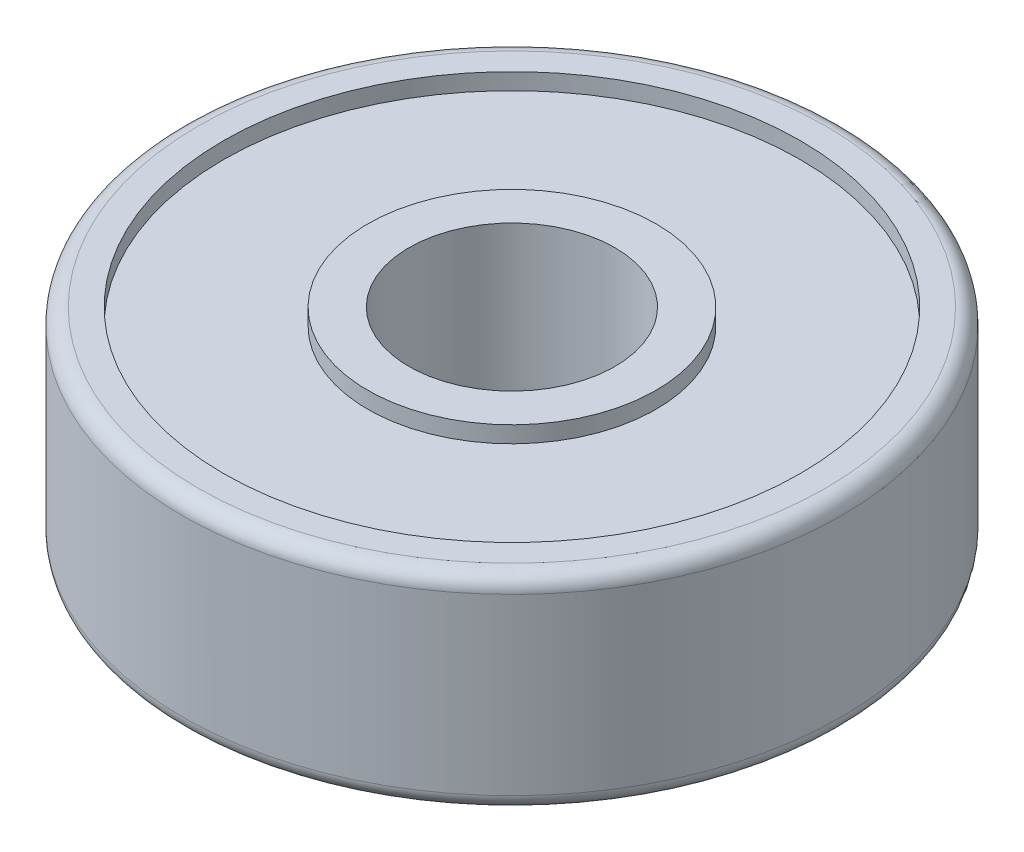
ISO-10303-21;
HEADER;
FILE_DESCRIPTION(('STEP AP214'),'2;1');
FILE_NAME('part.step','',(''),(''),'','','');
FILE_SCHEMA(('AUTOMOTIVE_DESIGN { 1 0 10303 214 1 1 1 1 }'));
ENDSEC;
DATA;
#1=APPLICATION_CONTEXT('core data for automotive mechanical design processes');
#2=APPLICATION_PROTOCOL_DEFINITION('international standard','automotive_design',2000,#1);
#3=PRODUCT_CONTEXT('',#1,'mechanical');
#4=PRODUCT('Part','Part','',(#3));
#5=PRODUCT_RELATED_PRODUCT_CATEGORY('part','',(#4));
#6=PRODUCT_DEFINITION_FORMATION('','',#4);
#7=PRODUCT_DEFINITION_CONTEXT('part definition',#1,'design');
#8=PRODUCT_DEFINITION('design','',#6,#7);
#9=PRODUCT_DEFINITION_SHAPE('','',#8);
#10=(LENGTH_UNIT() NAMED_UNIT(*) SI_UNIT(.MILLI.,.METRE.));
#11=(NAMED_UNIT(*) PLANE_ANGLE_UNIT() SI_UNIT($,.RADIAN.));
#12=(NAMED_UNIT(*) SI_UNIT($,.STERADIAN.) SOLID_ANGLE_UNIT());
#13=UNCERTAINTY_MEASURE_WITH_UNIT(LENGTH_MEASURE(1.E-05),#10,'distance_accuracy_value','');
#14=(GEOMETRIC_REPRESENTATION_CONTEXT(3) GLOBAL_UNCERTAINTY_ASSIGNED_CONTEXT((#13)) GLOBAL_UNIT_ASSIGNED_CONTEXT((#10,
#11,#12)) REPRESENTATION_CONTEXT('',''));
#15=CARTESIAN_POINT('',(0.,0.,0.));
#16=DIRECTION('',(0.,0.,1.));
#17=DIRECTION('',(1.,0.,0.));
#18=AXIS2_PLACEMENT_3D('',#15,#16,#17);
#19=CARTESIAN_POINT('',(0.,2.75,0.));
#20=DIRECTION('',(0.,-1.,0.));
#21=DIRECTION('',(0.,0.,-1.));
#22=AXIS2_PLACEMENT_3D('',#19,#20,#21);
#23=CYLINDRICAL_SURFACE('',#22,7.);
#24=CARTESIAN_POINT('',(0.,2.5,0.));
#25=DIRECTION('',(0.,-1.,0.));
#26=DIRECTION('',(0.,0.,-1.));
#27=AXIS2_PLACEMENT_3D('',#24,#25,#26);
#28=CIRCLE('',#27,7.);
#29=CARTESIAN_POINT('',(0.,2.5,-7.));
#30=VERTEX_POINT('',#29);
#31=EDGE_CURVE('E174',#30,#30,#28,.F.);
#32=ORIENTED_EDGE('',*,*,#31,.T.);
#33=EDGE_LOOP('',(#32));
#34=FACE_BOUND('',#33,.T.);
#35=CARTESIAN_POINT('',(0.,2.1,0.));
#36=DIRECTION('',(0.,-1.,0.));
#37=DIRECTION('',(0.,0.,-1.));
#38=AXIS2_PLACEMENT_3D('',#35,#36,#37);
#39=CIRCLE('',#38,7.);
#40=CARTESIAN_POINT('',(0.,2.1,-7.));
#41=VERTEX_POINT('',#40);
#42=EDGE_CURVE('E172',#41,#41,#39,.F.);
#43=ORIENTED_EDGE('',*,*,#42,.F.);
#44=EDGE_LOOP('',(#43));
#45=FACE_BOUND('',#44,.T.);
#46=ADVANCED_FACE('F17',(#34,#45),#23,.F.);
#47=CARTESIAN_POINT('',(0.,2.1,0.));
#48=DIRECTION('',(0.,1.,0.));
#49=DIRECTION('',(0.,0.,1.));
#50=AXIS2_PLACEMENT_3D('',#47,#48,#49);
#51=PLANE('',#50);
#52=ORIENTED_EDGE('',*,*,#42,.T.);
#53=EDGE_LOOP('',(#52));
#54=FACE_BOUND('',#53,.T.);
#55=CARTESIAN_POINT('',(0.,2.1,0.));
#56=DIRECTION('',(0.,-1.,0.));
#57=DIRECTION('',(0.,0.,-1.));
#58=AXIS2_PLACEMENT_3D('',#55,#56,#57);
#59=CIRCLE('',#58,3.5);
#60=CARTESIAN_POINT('',(0.,2.1,-3.5));
#61=VERTEX_POINT('',#60);
#62=EDGE_CURVE('E52',#61,#61,#59,.F.);
#63=ORIENTED_EDGE('',*,*,#62,.F.);
#64=EDGE_LOOP('',(#63));
#65=FACE_BOUND('',#64,.T.);
#66=ADVANCED_FACE('F97',(#54,#65),#51,.T.);
#67=CARTESIAN_POINT('',(0.,2.5,0.));
#68=DIRECTION('',(0.,-1.,0.));
#69=DIRECTION('',(0.,0.,-1.));
#70=AXIS2_PLACEMENT_3D('',#67,#68,#69);
#71=PLANE('',#70);
#72=ORIENTED_EDGE('',*,*,#31,.F.);
#73=EDGE_LOOP('',(#72));
#74=FACE_BOUND('',#73,.T.);
#75=CARTESIAN_POINT('',(0.,2.5,0.));
#76=DIRECTION('',(0.,-1.,0.));
#77=DIRECTION('',(1.,0.,0.));
#78=AXIS2_PLACEMENT_3D('',#75,#76,#77);
#79=CIRCLE('',#78,7.615);
#80=CARTESIAN_POINT('',(7.615,2.5,0.));
#81=VERTEX_POINT('',#80);
#82=CARTESIAN_POINT('',(-7.615,2.5,0.));
#83=VERTEX_POINT('',#82);
#84=EDGE_CURVE('E50',#81,#83,#79,.T.);
#85=ORIENTED_EDGE('',*,*,#84,.F.);
#86=CARTESIAN_POINT('',(0.,2.5,0.));
#87=DIRECTION('',(0.,-1.,0.));
#88=DIRECTION('',(-1.,0.,0.));
#89=AXIS2_PLACEMENT_3D('',#86,#87,#88);
#90=CIRCLE('',#89,7.615);
#91=EDGE_CURVE('E45',#83,#81,#90,.T.);
#92=ORIENTED_EDGE('',*,*,#91,.F.);
#93=EDGE_LOOP('',(#85,#92));
#94=FACE_BOUND('',#93,.T.);
#95=ADVANCED_FACE('F49',(#74,#94),#71,.F.);
#96=CARTESIAN_POINT('',(0.,2.75,0.));
#97=DIRECTION('',(0.,-1.,0.));
#98=DIRECTION('',(0.,0.,-1.));
#99=AXIS2_PLACEMENT_3D('',#96,#97,#98);
#100=CYLINDRICAL_SURFACE('',#99,3.5);
#101=CARTESIAN_POINT('',(0.,2.5,0.));
#102=DIRECTION('',(0.,-1.,0.));
#103=DIRECTION('',(0.,0.,-1.));
#104=AXIS2_PLACEMENT_3D('',#101,#102,#103);
#105=CIRCLE('',#104,3.5);
#106=CARTESIAN_POINT('',(0.,2.5,-3.5));
#107=VERTEX_POINT('',#106);
#108=EDGE_CURVE('E57',#107,#107,#105,.T.);
#109=ORIENTED_EDGE('',*,*,#108,.T.);
#110=EDGE_LOOP('',(#109));
#111=FACE_BOUND('',#110,.T.);
#112=ORIENTED_EDGE('',*,*,#62,.T.);
#113=EDGE_LOOP('',(#112));
#114=FACE_BOUND('',#113,.T.);
#115=ADVANCED_FACE('F76',(#111,#114),#100,.T.);
#116=CARTESIAN_POINT('',(0.,2.115,0.));
#117=DIRECTION('',(0.,-1.,0.));
#118=DIRECTION('',(1.,0.,0.));
#119=AXIS2_PLACEMENT_3D('',#116,#117,#118);
#120=TOROIDAL_SURFACE('',#119,7.615,0.385);
#121=CARTESIAN_POINT('',(0.,2.115,0.));
#122=DIRECTION('',(0.,-1.,0.));
#123=DIRECTION('',(0.,0.,-1.));
#124=AXIS2_PLACEMENT_3D('',#121,#122,#123);
#125=CIRCLE('',#124,8.);
#126=CARTESIAN_POINT('',(0.,2.115,-8.));
#127=VERTEX_POINT('',#126);
#128=EDGE_CURVE('E85',#127,#127,#125,.T.);
#129=ORIENTED_EDGE('',*,*,#128,.F.);
#130=EDGE_LOOP('',(#129));
#131=FACE_BOUND('',#130,.T.);
#132=ORIENTED_EDGE('',*,*,#84,.T.);
#133=ORIENTED_EDGE('',*,*,#91,.T.);
#134=EDGE_LOOP('',(#132,#133));
#135=FACE_BOUND('',#134,.T.);
#136=ADVANCED_FACE('F56',(#131,#135),#120,.T.);
#137=CARTESIAN_POINT('',(0.,2.5,0.));
#138=DIRECTION('',(0.,-1.,0.));
#139=DIRECTION('',(0.,0.,-1.));
#140=AXIS2_PLACEMENT_3D('',#137,#138,#139);
#141=PLANE('',#140);
#142=CARTESIAN_POINT('',(0.,2.5,0.));
#143=DIRECTION('',(0.,-1.,0.));
#144=DIRECTION('',(0.,0.,-1.));
#145=AXIS2_PLACEMENT_3D('',#142,#143,#144);
#146=CIRCLE('',#145,2.5);
#147=CARTESIAN_POINT('',(0.,2.5,-2.5));
#148=VERTEX_POINT('',#147);
#149=EDGE_CURVE('E87',#148,#148,#146,.T.);
#150=ORIENTED_EDGE('',*,*,#149,.T.);
#151=EDGE_LOOP('',(#150));
#152=FACE_BOUND('',#151,.T.);
#153=ORIENTED_EDGE('',*,*,#108,.F.);
#154=EDGE_LOOP('',(#153));
#155=FACE_BOUND('',#154,.T.);
#156=ADVANCED_FACE('F75',(#152,#155),#141,.F.);
#157=CARTESIAN_POINT('',(0.,2.75,0.));
#158=DIRECTION('',(0.,-1.,0.));
#159=DIRECTION('',(0.,0.,-1.));
#160=AXIS2_PLACEMENT_3D('',#157,#158,#159);
#161=CYLINDRICAL_SURFACE('',#160,8.);
#162=CARTESIAN_POINT('',(0.,-2.115,0.));
#163=DIRECTION('',(0.,-1.,0.));
#164=DIRECTION('',(1.,0.,0.));
#165=AXIS2_PLACEMENT_3D('',#162,#163,#164);
#166=CIRCLE('',#165,8.);
#167=CARTESIAN_POINT('',(8.,-2.115,0.));
#168=VERTEX_POINT('',#167);
#169=EDGE_CURVE('E83',#168,#168,#166,.T.);
#170=ORIENTED_EDGE('',*,*,#169,.F.);
#171=EDGE_LOOP('',(#170));
#172=FACE_BOUND('',#171,.T.);
#173=ORIENTED_EDGE('',*,*,#128,.T.);
#174=EDGE_LOOP('',(#173));
#175=FACE_BOUND('',#174,.T.);
#176=ADVANCED_FACE('F202',(#172,#175),#161,.T.);
#177=CARTESIAN_POINT('',(0.,2.75,0.));
#178=DIRECTION('',(0.,-1.,0.));
#179=DIRECTION('',(0.,0.,-1.));
#180=AXIS2_PLACEMENT_3D('',#177,#178,#179);
#181=CYLINDRICAL_SURFACE('',#180,2.5);
#182=CARTESIAN_POINT('',(0.,-2.5,0.));
#183=DIRECTION('',(0.,-1.,0.));
#184=DIRECTION('',(0.,0.,-1.));
#185=AXIS2_PLACEMENT_3D('',#182,#183,#184);
#186=CIRCLE('',#185,2.5);
#187=CARTESIAN_POINT('',(0.,-2.5,-2.5));
#188=VERTEX_POINT('',#187);
#189=EDGE_CURVE('E183',#188,#188,#186,.F.);
#190=ORIENTED_EDGE('',*,*,#189,.F.);
#191=EDGE_LOOP('',(#190));
#192=FACE_BOUND('',#191,.T.);
#193=ORIENTED_EDGE('',*,*,#149,.F.);
#194=EDGE_LOOP('',(#193));
#195=FACE_BOUND('',#194,.T.);
#196=ADVANCED_FACE('F157',(#192,#195),#181,.F.);
#197=CARTESIAN_POINT('',(0.,-2.115,0.));
#198=DIRECTION('',(0.,-1.,0.));
#199=DIRECTION('',(1.,0.,0.));
#200=AXIS2_PLACEMENT_3D('',#197,#198,#199);
#201=TOROIDAL_SURFACE('',#200,7.615,0.385);
#202=CARTESIAN_POINT('',(0.,-2.5,0.));
#203=DIRECTION('',(0.,1.,0.));
#204=DIRECTION('',(1.,0.,0.));
#205=AXIS2_PLACEMENT_3D('',#202,#203,#204);
#206=CIRCLE('',#205,7.615);
#207=CARTESIAN_POINT('',(-7.615,-2.5,0.));
#208=VERTEX_POINT('',#207);
#209=CARTESIAN_POINT('',(7.615,-2.5,0.));
#210=VERTEX_POINT('',#209);
#211=EDGE_CURVE('E36',#208,#210,#206,.F.);
#212=ORIENTED_EDGE('',*,*,#211,.F.);
#213=CARTESIAN_POINT('',(0.,-2.5,0.));
#214=DIRECTION('',(0.,1.,0.));
#215=DIRECTION('',(-1.,0.,0.));
#216=AXIS2_PLACEMENT_3D('',#213,#214,#215);
#217=CIRCLE('',#216,7.615);
#218=EDGE_CURVE('E190',#210,#208,#217,.F.);
#219=ORIENTED_EDGE('',*,*,#218,.F.);
#220=EDGE_LOOP('',(#212,#219));
#221=FACE_BOUND('',#220,.T.);
#222=ORIENTED_EDGE('',*,*,#169,.T.);
#223=EDGE_LOOP('',(#222));
#224=FACE_BOUND('',#223,.T.);
#225=ADVANCED_FACE('F153',(#221,#224),#201,.T.);
#226=CARTESIAN_POINT('',(0.,-2.5,0.));
#227=DIRECTION('',(0.,-1.,0.));
#228=DIRECTION('',(0.,0.,-1.));
#229=AXIS2_PLACEMENT_3D('',#226,#227,#228);
#230=PLANE('',#229);
#231=ORIENTED_EDGE('',*,*,#189,.T.);
#232=EDGE_LOOP('',(#231));
#233=FACE_BOUND('',#232,.T.);
#234=CARTESIAN_POINT('',(0.,-2.5,0.));
#235=DIRECTION('',(0.,-1.,0.));
#236=DIRECTION('',(0.,0.,-1.));
#237=AXIS2_PLACEMENT_3D('',#234,#235,#236);
#238=CIRCLE('',#237,3.5);
#239=CARTESIAN_POINT('',(0.,-2.5,-3.5));
#240=VERTEX_POINT('',#239);
#241=EDGE_CURVE('E186',#240,#240,#238,.F.);
#242=ORIENTED_EDGE('',*,*,#241,.F.);
#243=EDGE_LOOP('',(#242));
#244=FACE_BOUND('',#243,.T.);
#245=ADVANCED_FACE('F134',(#233,#244),#230,.T.);
#246=CARTESIAN_POINT('',(0.,-2.5,0.));
#247=DIRECTION('',(0.,-1.,0.));
#248=DIRECTION('',(0.,0.,-1.));
#249=AXIS2_PLACEMENT_3D('',#246,#247,#248);
#250=PLANE('',#249);
#251=CARTESIAN_POINT('',(0.,-2.5,0.));
#252=DIRECTION('',(0.,-1.,0.));
#253=DIRECTION('',(0.,0.,-1.));
#254=AXIS2_PLACEMENT_3D('',#251,#252,#253);
#255=CIRCLE('',#254,7.);
#256=CARTESIAN_POINT('',(0.,-2.5,-7.));
#257=VERTEX_POINT('',#256);
#258=EDGE_CURVE('E189',#257,#257,#255,.F.);
#259=ORIENTED_EDGE('',*,*,#258,.T.);
#260=EDGE_LOOP('',(#259));
#261=FACE_BOUND('',#260,.T.);
#262=ORIENTED_EDGE('',*,*,#211,.T.);
#263=ORIENTED_EDGE('',*,*,#218,.T.);
#264=EDGE_LOOP('',(#262,#263));
#265=FACE_BOUND('',#264,.T.);
#266=ADVANCED_FACE('F129',(#261,#265),#250,.T.);
#267=CARTESIAN_POINT('',(0.,2.75,0.));
#268=DIRECTION('',(0.,-1.,0.));
#269=DIRECTION('',(0.,0.,-1.));
#270=AXIS2_PLACEMENT_3D('',#267,#268,#269);
#271=CYLINDRICAL_SURFACE('',#270,3.5);
#272=ORIENTED_EDGE('',*,*,#241,.T.);
#273=EDGE_LOOP('',(#272));
#274=FACE_BOUND('',#273,.T.);
#275=CARTESIAN_POINT('',(0.,-2.1,0.));
#276=DIRECTION('',(0.,-1.,0.));
#277=DIRECTION('',(0.,0.,-1.));
#278=AXIS2_PLACEMENT_3D('',#275,#276,#277);
#279=CIRCLE('',#278,3.5);
#280=CARTESIAN_POINT('',(0.,-2.1,-3.5));
#281=VERTEX_POINT('',#280);
#282=EDGE_CURVE('E28',#281,#281,#279,.T.);
#283=ORIENTED_EDGE('',*,*,#282,.T.);
#284=EDGE_LOOP('',(#283));
#285=FACE_BOUND('',#284,.T.);
#286=ADVANCED_FACE('F118',(#274,#285),#271,.T.);
#287=CARTESIAN_POINT('',(0.,2.75,0.));
#288=DIRECTION('',(0.,-1.,0.));
#289=DIRECTION('',(0.,0.,-1.));
#290=AXIS2_PLACEMENT_3D('',#287,#288,#289);
#291=CYLINDRICAL_SURFACE('',#290,7.);
#292=ORIENTED_EDGE('',*,*,#258,.F.);
#293=EDGE_LOOP('',(#292));
#294=FACE_BOUND('',#293,.T.);
#295=CARTESIAN_POINT('',(0.,-2.1,0.));
#296=DIRECTION('',(0.,-1.,0.));
#297=DIRECTION('',(0.,0.,-1.));
#298=AXIS2_PLACEMENT_3D('',#295,#296,#297);
#299=CIRCLE('',#298,7.);
#300=CARTESIAN_POINT('',(0.,-2.1,-7.));
#301=VERTEX_POINT('',#300);
#302=EDGE_CURVE('E11',#301,#301,#299,.F.);
#303=ORIENTED_EDGE('',*,*,#302,.T.);
#304=EDGE_LOOP('',(#303));
#305=FACE_BOUND('',#304,.T.);
#306=ADVANCED_FACE('F111',(#294,#305),#291,.F.);
#307=CARTESIAN_POINT('',(0.,-2.1,0.));
#308=DIRECTION('',(0.,1.,0.));
#309=DIRECTION('',(0.,0.,1.));
#310=AXIS2_PLACEMENT_3D('',#307,#308,#309);
#311=PLANE('',#310);
#312=ORIENTED_EDGE('',*,*,#302,.F.);
#313=EDGE_LOOP('',(#312));
#314=FACE_BOUND('',#313,.T.);
#315=ORIENTED_EDGE('',*,*,#282,.F.);
#316=EDGE_LOOP('',(#315));
#317=FACE_BOUND('',#316,.T.);
#318=ADVANCED_FACE('F109',(#314,#317),#311,.F.);
#319=CLOSED_SHELL('',(#46,#66,#95,#115,#136,#156,#176,#196,#225,#245,#266,#286,#306,#318));
#320=CARTESIAN_POINT('',(0.,0.,0.));
#321=DIRECTION('',(0.,-1.,0.));
#322=DIRECTION('',(1.,0.,0.));
#323=AXIS2_PLACEMENT_3D('',#320,#321,#322);
#324=TOROIDAL_SURFACE('',#323,5.2,1.75);
#325=ADVANCED_FACE('F124',(),#324,.F.);
#326=CLOSED_SHELL('',(#325));
#327=ORIENTED_CLOSED_SHELL('',*,#326,.T.);
#328=BREP_WITH_VOIDS('B1',#319,(#327));
#329=ADVANCED_BREP_SHAPE_REPRESENTATION('',(#18,#328),#14);
#330=SHAPE_DEFINITION_REPRESENTATION(#9,#329);
ENDSEC;
END-ISO-10303-21;
